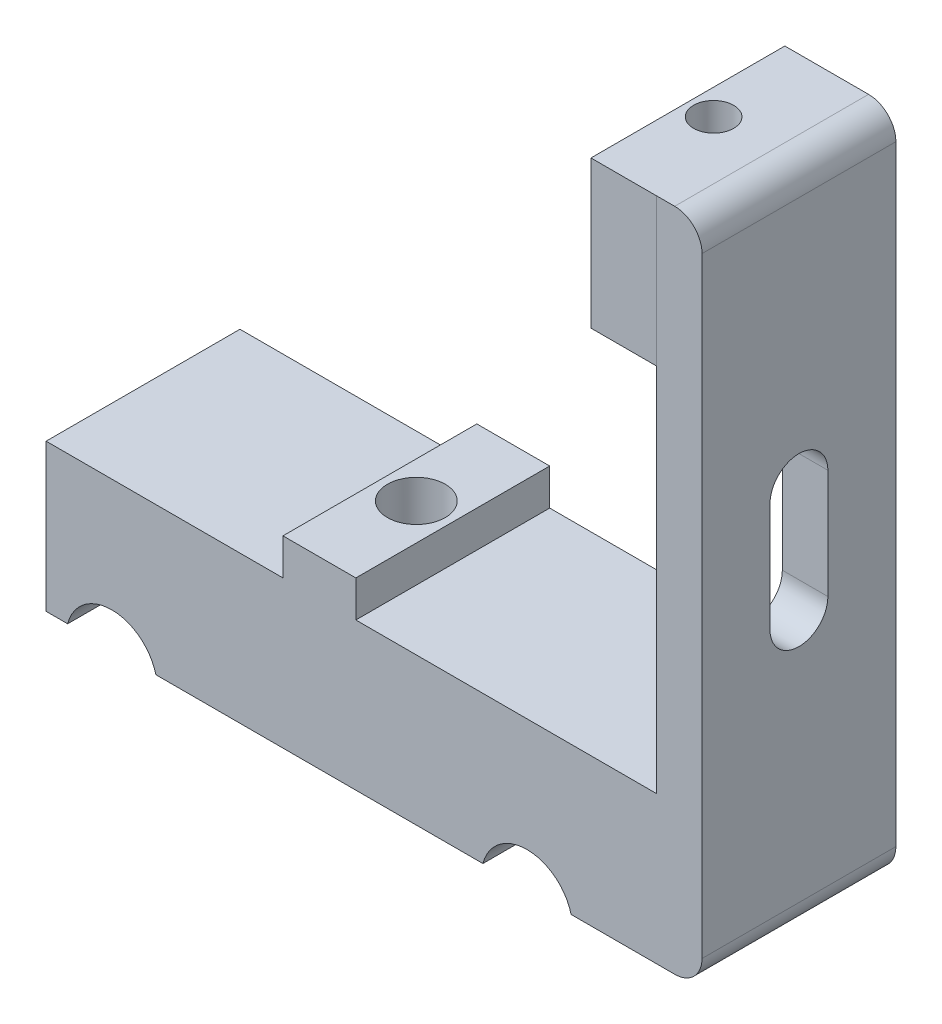
ISO-10303-21;
HEADER;
FILE_DESCRIPTION(('STEP AP214'),'2;1');
FILE_NAME('part.step','',(''),(''),'','','');
FILE_SCHEMA(('AUTOMOTIVE_DESIGN { 1 0 10303 214 1 1 1 1 }'));
ENDSEC;
DATA;
#1=APPLICATION_CONTEXT('core data for automotive mechanical design processes');
#2=APPLICATION_PROTOCOL_DEFINITION('international standard','automotive_design',2000,#1);
#3=PRODUCT_CONTEXT('',#1,'mechanical');
#4=PRODUCT('Part','Part','',(#3));
#5=PRODUCT_RELATED_PRODUCT_CATEGORY('part','',(#4));
#6=PRODUCT_DEFINITION_FORMATION('','',#4);
#7=PRODUCT_DEFINITION_CONTEXT('part definition',#1,'design');
#8=PRODUCT_DEFINITION('design','',#6,#7);
#9=PRODUCT_DEFINITION_SHAPE('','',#8);
#10=(LENGTH_UNIT() NAMED_UNIT(*) SI_UNIT(.MILLI.,.METRE.));
#11=(NAMED_UNIT(*) PLANE_ANGLE_UNIT() SI_UNIT($,.RADIAN.));
#12=(NAMED_UNIT(*) SI_UNIT($,.STERADIAN.) SOLID_ANGLE_UNIT());
#13=UNCERTAINTY_MEASURE_WITH_UNIT(LENGTH_MEASURE(1.E-05),#10,'distance_accuracy_value','');
#14=(GEOMETRIC_REPRESENTATION_CONTEXT(3) GLOBAL_UNCERTAINTY_ASSIGNED_CONTEXT((#13)) GLOBAL_UNIT_ASSIGNED_CONTEXT((#10,
#11,#12)) REPRESENTATION_CONTEXT('',''));
#15=CARTESIAN_POINT('',(0.,0.,0.));
#16=DIRECTION('',(0.,0.,1.));
#17=DIRECTION('',(1.,0.,0.));
#18=AXIS2_PLACEMENT_3D('',#15,#16,#17);
#19=CARTESIAN_POINT('',(37.,52.03,-10.6413287433298));
#20=DIRECTION('',(1.,0.,0.));
#21=DIRECTION('',(0.,1.,0.));
#22=AXIS2_PLACEMENT_3D('',#19,#20,#21);
#23=PLANE('',#22);
#24=DIRECTION('',(0.,1.,0.));
#25=VECTOR('',#24,1.);
#26=CARTESIAN_POINT('',(37.,52.03,-3.175));
#27=LINE('',#26,#25);
#28=CARTESIAN_POINT('',(37.,9.525,-3.175));
#29=VERTEX_POINT('',#28);
#30=CARTESIAN_POINT('',(37.,21.525,-3.175));
#31=VERTEX_POINT('',#30);
#32=EDGE_CURVE('E260',#29,#31,#27,.T.);
#33=ORIENTED_EDGE('',*,*,#32,.T.);
#34=CARTESIAN_POINT('',(37.,21.525,0.));
#35=DIRECTION('',(1.,0.,0.));
#36=DIRECTION('',(0.,1.,0.));
#37=AXIS2_PLACEMENT_3D('',#34,#35,#36);
#38=CIRCLE('',#37,3.175);
#39=CARTESIAN_POINT('',(37.,21.525,3.175));
#40=VERTEX_POINT('',#39);
#41=EDGE_CURVE('E264',#31,#40,#38,.T.);
#42=ORIENTED_EDGE('',*,*,#41,.T.);
#43=DIRECTION('',(0.,-1.,0.));
#44=VECTOR('',#43,1.);
#45=CARTESIAN_POINT('',(37.,52.03,3.175));
#46=LINE('',#45,#44);
#47=CARTESIAN_POINT('',(37.,9.525,3.175));
#48=VERTEX_POINT('',#47);
#49=EDGE_CURVE('E251',#40,#48,#46,.T.);
#50=ORIENTED_EDGE('',*,*,#49,.T.);
#51=CARTESIAN_POINT('',(37.,9.525,0.));
#52=DIRECTION('',(1.,0.,0.));
#53=DIRECTION('',(0.,1.,0.));
#54=AXIS2_PLACEMENT_3D('',#51,#52,#53);
#55=CIRCLE('',#54,3.175);
#56=EDGE_CURVE('E226',#48,#29,#55,.T.);
#57=ORIENTED_EDGE('',*,*,#56,.T.);
#58=EDGE_LOOP('',(#33,#42,#50,#57));
#59=FACE_BOUND('',#58,.T.);
#60=DIRECTION('',(0.,0.,1.));
#61=VECTOR('',#60,1.);
#62=CARTESIAN_POINT('',(37.,35.85,10.6430024789024));
#63=LINE('',#62,#61);
#64=CARTESIAN_POINT('',(37.,35.85,-10.6413287433298));
#65=VERTEX_POINT('',#64);
#66=CARTESIAN_POINT('',(37.,35.85,10.64));
#67=VERTEX_POINT('',#66);
#68=EDGE_CURVE('E305',#65,#67,#63,.T.);
#69=ORIENTED_EDGE('',*,*,#68,.F.);
#70=DIRECTION('',(0.,-1.,0.));
#71=VECTOR('',#70,1.);
#72=CARTESIAN_POINT('',(37.,52.03,-10.6413287433298));
#73=LINE('',#72,#71);
#74=CARTESIAN_POINT('',(37.,-4.8,-10.6413287433298));
#75=VERTEX_POINT('',#74);
#76=EDGE_CURVE('E361',#65,#75,#73,.T.);
#77=ORIENTED_EDGE('',*,*,#76,.T.);
#78=DIRECTION('',(0.,0.,1.));
#79=VECTOR('',#78,1.);
#80=CARTESIAN_POINT('',(37.,-4.8,-10.6413287433298));
#81=LINE('',#80,#79);
#82=CARTESIAN_POINT('',(37.,-4.8,-10.64));
#83=VERTEX_POINT('',#82);
#84=EDGE_CURVE('E341',#75,#83,#81,.T.);
#85=ORIENTED_EDGE('',*,*,#84,.T.);
#86=CARTESIAN_POINT('',(37.,-4.8,10.64));
#87=VERTEX_POINT('',#86);
#88=EDGE_CURVE('E353',#83,#87,#81,.T.);
#89=ORIENTED_EDGE('',*,*,#88,.T.);
#90=DIRECTION('',(0.,-1.,0.));
#91=VECTOR('',#90,1.);
#92=CARTESIAN_POINT('',(37.,52.03,10.64));
#93=LINE('',#92,#91);
#94=EDGE_CURVE('E345',#67,#87,#93,.T.);
#95=ORIENTED_EDGE('',*,*,#94,.F.);
#96=EDGE_LOOP('',(#69,#77,#85,#89,#95));
#97=FACE_BOUND('',#96,.T.);
#98=ADVANCED_FACE('F51',(#59,#97),#23,.F.);
#99=CARTESIAN_POINT('',(0.,-4.8,10.64));
#100=DIRECTION('',(0.,1.,0.));
#101=DIRECTION('',(-1.,0.,0.));
#102=AXIS2_PLACEMENT_3D('',#99,#100,#101);
#103=PLANE('',#102);
#104=CARTESIAN_POINT('',(32.6328780779036,-4.79999999999999,0.));
#105=DIRECTION('',(0.,1.,0.));
#106=DIRECTION('',(-1.,0.,0.));
#107=AXIS2_PLACEMENT_3D('',#104,#105,#106);
#108=CIRCLE('',#107,2.2);
#109=CARTESIAN_POINT('',(30.4328780779036,-4.79999999999999,0.));
#110=VERTEX_POINT('',#109);
#111=EDGE_CURVE('E295',#110,#110,#108,.T.);
#112=ORIENTED_EDGE('',*,*,#111,.F.);
#113=EDGE_LOOP('',(#112));
#114=FACE_BOUND('',#113,.T.);
#115=DIRECTION('',(1.,0.,0.));
#116=VECTOR('',#115,1.);
#117=CARTESIAN_POINT('',(0.,-4.8,10.64));
#118=LINE('',#117,#116);
#119=CARTESIAN_POINT('',(4.00000000000001,-4.8,10.64));
#120=VERTEX_POINT('',#119);
#121=EDGE_CURVE('E417',#120,#87,#118,.T.);
#122=ORIENTED_EDGE('',*,*,#121,.T.);
#123=ORIENTED_EDGE('',*,*,#88,.F.);
#124=DIRECTION('',(1.,0.,0.));
#125=VECTOR('',#124,1.);
#126=CARTESIAN_POINT('',(0.,-4.8,-10.64));
#127=LINE('',#126,#125);
#128=CARTESIAN_POINT('',(4.00000000000001,-4.8,-10.64));
#129=VERTEX_POINT('',#128);
#130=EDGE_CURVE('E440',#129,#83,#127,.T.);
#131=ORIENTED_EDGE('',*,*,#130,.F.);
#132=DIRECTION('',(0.,0.,-1.));
#133=VECTOR('',#132,1.);
#134=CARTESIAN_POINT('',(4.00000000000001,-4.8,10.64));
#135=LINE('',#134,#133);
#136=EDGE_CURVE('E460',#120,#129,#135,.T.);
#137=ORIENTED_EDGE('',*,*,#136,.F.);
#138=EDGE_LOOP('',(#122,#123,#131,#137));
#139=FACE_BOUND('',#138,.T.);
#140=ADVANCED_FACE('F514',(#114,#139),#103,.T.);
#141=CARTESIAN_POINT('',(0.,-20.98,10.64));
#142=DIRECTION('',(0.,1.,0.));
#143=DIRECTION('',(-1.,0.,0.));
#144=AXIS2_PLACEMENT_3D('',#141,#142,#143);
#145=PLANE('',#144);
#146=CARTESIAN_POINT('',(0.000925950515747243,-20.98,0.));
#147=DIRECTION('',(0.,-1.,0.));
#148=DIRECTION('',(1.,0.,0.));
#149=AXIS2_PLACEMENT_3D('',#146,#147,#148);
#150=CIRCLE('',#149,3.175);
#151=CARTESIAN_POINT('',(3.17592595051575,-20.98,0.));
#152=VERTEX_POINT('',#151);
#153=EDGE_CURVE('E282',#152,#152,#150,.T.);
#154=ORIENTED_EDGE('',*,*,#153,.F.);
#155=EDGE_LOOP('',(#154));
#156=FACE_BOUND('',#155,.T.);
#157=DIRECTION('',(0.,0.,-1.));
#158=VECTOR('',#157,1.);
#159=CARTESIAN_POINT('',(-17.9490740494843,-20.98,10.8));
#160=LINE('',#159,#158);
#161=CARTESIAN_POINT('',(-17.9490740494843,-20.98,-10.64));
#162=VERTEX_POINT('',#161);
#163=CARTESIAN_POINT('',(-17.9490740494843,-20.98,10.64));
#164=VERTEX_POINT('',#163);
#165=EDGE_CURVE('E403',#162,#164,#160,.F.);
#166=ORIENTED_EDGE('',*,*,#165,.F.);
#167=DIRECTION('',(1.,0.,0.));
#168=VECTOR('',#167,1.);
#169=CARTESIAN_POINT('',(0.,-20.98,-10.64));
#170=LINE('',#169,#168);
#171=CARTESIAN_POINT('',(17.9490740494842,-20.98,-10.64));
#172=VERTEX_POINT('',#171);
#173=EDGE_CURVE('E441',#162,#172,#170,.T.);
#174=ORIENTED_EDGE('',*,*,#173,.T.);
#175=DIRECTION('',(0.,0.,-1.));
#176=VECTOR('',#175,1.);
#177=CARTESIAN_POINT('',(17.9490740494843,-20.98,10.8));
#178=LINE('',#177,#176);
#179=CARTESIAN_POINT('',(17.9490740494842,-20.98,10.64));
#180=VERTEX_POINT('',#179);
#181=EDGE_CURVE('E390',#180,#172,#178,.T.);
#182=ORIENTED_EDGE('',*,*,#181,.F.);
#183=DIRECTION('',(1.,0.,0.));
#184=VECTOR('',#183,1.);
#185=CARTESIAN_POINT('',(0.,-20.98,10.64));
#186=LINE('',#185,#184);
#187=EDGE_CURVE('E418',#164,#180,#186,.T.);
#188=ORIENTED_EDGE('',*,*,#187,.F.);
#189=EDGE_LOOP('',(#166,#174,#182,#188));
#190=FACE_BOUND('',#189,.T.);
#191=ADVANCED_FACE('F522',(#156,#190),#145,.F.);
#192=DIRECTION('',(0.,0.,-1.));
#193=VECTOR('',#192,1.);
#194=CARTESIAN_POINT('',(-27.6328780779036,-20.98,10.8));
#195=LINE('',#194,#193);
#196=CARTESIAN_POINT('',(-27.6328780779036,-20.98,10.64));
#197=VERTEX_POINT('',#196);
#198=CARTESIAN_POINT('',(-27.6328780779036,-20.98,-10.64));
#199=VERTEX_POINT('',#198);
#200=EDGE_CURVE('E400',#197,#199,#195,.T.);
#201=ORIENTED_EDGE('',*,*,#200,.F.);
#202=CARTESIAN_POINT('',(-30.,-20.98,10.64));
#203=VERTEX_POINT('',#202);
#204=EDGE_CURVE('E413',#203,#197,#186,.T.);
#205=ORIENTED_EDGE('',*,*,#204,.F.);
#206=DIRECTION('',(0.,0.,-1.));
#207=VECTOR('',#206,1.);
#208=CARTESIAN_POINT('',(-30.,-20.98,10.64));
#209=LINE('',#208,#207);
#210=CARTESIAN_POINT('',(-30.,-20.98,-10.64));
#211=VERTEX_POINT('',#210);
#212=EDGE_CURVE('E464',#203,#211,#209,.T.);
#213=ORIENTED_EDGE('',*,*,#212,.T.);
#214=EDGE_CURVE('E436',#211,#199,#170,.T.);
#215=ORIENTED_EDGE('',*,*,#214,.T.);
#216=EDGE_LOOP('',(#201,#205,#213,#215));
#217=FACE_BOUND('',#216,.T.);
#218=ADVANCED_FACE('F567',(#217),#145,.F.);
#219=CARTESIAN_POINT('',(32.6328780779036,-20.98,0.));
#220=DIRECTION('',(0.,-1.,0.));
#221=DIRECTION('',(1.,0.,0.));
#222=AXIS2_PLACEMENT_3D('',#219,#220,#221);
#223=CIRCLE('',#222,2.2);
#224=CARTESIAN_POINT('',(34.8328780779036,-20.98,0.));
#225=VERTEX_POINT('',#224);
#226=EDGE_CURVE('E286',#225,#225,#223,.T.);
#227=ORIENTED_EDGE('',*,*,#226,.F.);
#228=EDGE_LOOP('',(#227));
#229=FACE_BOUND('',#228,.T.);
#230=CARTESIAN_POINT('',(27.6328780779036,-20.98,-10.64));
#231=VERTEX_POINT('',#230);
#232=CARTESIAN_POINT('',(39.,-20.98,-10.64));
#233=VERTEX_POINT('',#232);
#234=EDGE_CURVE('E435',#231,#233,#170,.T.);
#235=ORIENTED_EDGE('',*,*,#234,.T.);
#236=DIRECTION('',(0.,0.,-1.));
#237=VECTOR('',#236,1.);
#238=CARTESIAN_POINT('',(39.,-20.98,10.64));
#239=LINE('',#238,#237);
#240=CARTESIAN_POINT('',(39.,-20.98,10.64));
#241=VERTEX_POINT('',#240);
#242=EDGE_CURVE('E12',#233,#241,#239,.F.);
#243=ORIENTED_EDGE('',*,*,#242,.T.);
#244=CARTESIAN_POINT('',(27.6328780779036,-20.98,10.64));
#245=VERTEX_POINT('',#244);
#246=EDGE_CURVE('E411',#245,#241,#186,.T.);
#247=ORIENTED_EDGE('',*,*,#246,.F.);
#248=DIRECTION('',(0.,0.,-1.));
#249=VECTOR('',#248,1.);
#250=CARTESIAN_POINT('',(27.6328780779036,-20.98,10.8));
#251=LINE('',#250,#249);
#252=EDGE_CURVE('E393',#231,#245,#251,.F.);
#253=ORIENTED_EDGE('',*,*,#252,.F.);
#254=EDGE_LOOP('',(#235,#243,#247,#253));
#255=FACE_BOUND('',#254,.T.);
#256=ADVANCED_FACE('F569',(#229,#255),#145,.F.);
#257=CARTESIAN_POINT('',(-30.,0.,10.64));
#258=DIRECTION('',(1.,0.,0.));
#259=DIRECTION('',(0.,0.,-1.));
#260=AXIS2_PLACEMENT_3D('',#257,#258,#259);
#261=PLANE('',#260);
#262=DIRECTION('',(0.,-1.,0.));
#263=VECTOR('',#262,1.);
#264=CARTESIAN_POINT('',(-30.,0.,-10.64));
#265=LINE('',#264,#263);
#266=CARTESIAN_POINT('',(-30.,-4.8,-10.64));
#267=VERTEX_POINT('',#266);
#268=EDGE_CURVE('E406',#267,#211,#265,.T.);
#269=ORIENTED_EDGE('',*,*,#268,.T.);
#270=ORIENTED_EDGE('',*,*,#212,.F.);
#271=DIRECTION('',(0.,-1.,0.));
#272=VECTOR('',#271,1.);
#273=CARTESIAN_POINT('',(-30.,0.,10.64));
#274=LINE('',#273,#272);
#275=CARTESIAN_POINT('',(-30.,-4.8,10.64));
#276=VERTEX_POINT('',#275);
#277=EDGE_CURVE('E407',#276,#203,#274,.T.);
#278=ORIENTED_EDGE('',*,*,#277,.F.);
#279=DIRECTION('',(0.,0.,-1.));
#280=VECTOR('',#279,1.);
#281=CARTESIAN_POINT('',(-30.,-4.8,10.64));
#282=LINE('',#281,#280);
#283=EDGE_CURVE('E431',#276,#267,#282,.T.);
#284=ORIENTED_EDGE('',*,*,#283,.T.);
#285=EDGE_LOOP('',(#269,#270,#278,#284));
#286=FACE_BOUND('',#285,.T.);
#287=ADVANCED_FACE('F562',(#286),#261,.F.);
#288=CARTESIAN_POINT('',(4.,0.,10.64));
#289=DIRECTION('',(1.,0.,0.));
#290=DIRECTION('',(0.,1.,0.));
#291=AXIS2_PLACEMENT_3D('',#288,#289,#290);
#292=PLANE('',#291);
#293=DIRECTION('',(0.,0.,-1.));
#294=VECTOR('',#293,1.);
#295=CARTESIAN_POINT('',(4.,-0.8,10.64));
#296=LINE('',#295,#294);
#297=CARTESIAN_POINT('',(4.,-0.8,10.64));
#298=VERTEX_POINT('',#297);
#299=CARTESIAN_POINT('',(4.,-0.8,-10.64));
#300=VERTEX_POINT('',#299);
#301=EDGE_CURVE('E276',#298,#300,#296,.T.);
#302=ORIENTED_EDGE('',*,*,#301,.F.);
#303=DIRECTION('',(0.,-1.,0.));
#304=VECTOR('',#303,1.);
#305=CARTESIAN_POINT('',(4.,0.,10.64));
#306=LINE('',#305,#304);
#307=EDGE_CURVE('E422',#298,#120,#306,.T.);
#308=ORIENTED_EDGE('',*,*,#307,.T.);
#309=ORIENTED_EDGE('',*,*,#136,.T.);
#310=DIRECTION('',(0.,-1.,0.));
#311=VECTOR('',#310,1.);
#312=CARTESIAN_POINT('',(4.,0.,-10.64));
#313=LINE('',#312,#311);
#314=EDGE_CURVE('E445',#300,#129,#313,.T.);
#315=ORIENTED_EDGE('',*,*,#314,.F.);
#316=EDGE_LOOP('',(#302,#308,#309,#315));
#317=FACE_BOUND('',#316,.T.);
#318=ADVANCED_FACE('F559',(#317),#292,.T.);
#319=CARTESIAN_POINT('',(-4.,0.,10.64));
#320=DIRECTION('',(1.,0.,0.));
#321=DIRECTION('',(0.,0.,-1.));
#322=AXIS2_PLACEMENT_3D('',#319,#320,#321);
#323=PLANE('',#322);
#324=DIRECTION('',(0.,-1.,0.));
#325=VECTOR('',#324,1.);
#326=CARTESIAN_POINT('',(-4.,0.,10.64));
#327=LINE('',#326,#325);
#328=CARTESIAN_POINT('',(-4.,-0.8,10.64));
#329=VERTEX_POINT('',#328);
#330=CARTESIAN_POINT('',(-4.,-4.8,10.64));
#331=VERTEX_POINT('',#330);
#332=EDGE_CURVE('E425',#329,#331,#327,.T.);
#333=ORIENTED_EDGE('',*,*,#332,.F.);
#334=DIRECTION('',(0.,0.,-1.));
#335=VECTOR('',#334,1.);
#336=CARTESIAN_POINT('',(-4.,-0.8,10.64));
#337=LINE('',#336,#335);
#338=CARTESIAN_POINT('',(-4.,-0.8,-10.64));
#339=VERTEX_POINT('',#338);
#340=EDGE_CURVE('E272',#329,#339,#337,.T.);
#341=ORIENTED_EDGE('',*,*,#340,.T.);
#342=DIRECTION('',(0.,-1.,0.));
#343=VECTOR('',#342,1.);
#344=CARTESIAN_POINT('',(-4.,0.,-10.64));
#345=LINE('',#344,#343);
#346=CARTESIAN_POINT('',(-4.,-4.8,-10.64));
#347=VERTEX_POINT('',#346);
#348=EDGE_CURVE('E448',#339,#347,#345,.T.);
#349=ORIENTED_EDGE('',*,*,#348,.T.);
#350=DIRECTION('',(0.,0.,-1.));
#351=VECTOR('',#350,1.);
#352=CARTESIAN_POINT('',(-4.,-4.8,10.64));
#353=LINE('',#352,#351);
#354=EDGE_CURVE('E456',#331,#347,#353,.T.);
#355=ORIENTED_EDGE('',*,*,#354,.F.);
#356=EDGE_LOOP('',(#333,#341,#349,#355));
#357=FACE_BOUND('',#356,.T.);
#358=ADVANCED_FACE('F555',(#357),#323,.F.);
#359=CARTESIAN_POINT('',(0.,-4.8,10.64));
#360=DIRECTION('',(0.,-1.,0.));
#361=DIRECTION('',(1.,0.,0.));
#362=AXIS2_PLACEMENT_3D('',#359,#360,#361);
#363=PLANE('',#362);
#364=DIRECTION('',(-1.,0.,0.));
#365=VECTOR('',#364,1.);
#366=CARTESIAN_POINT('',(0.,-4.8,-10.64));
#367=LINE('',#366,#365);
#368=EDGE_CURVE('E412',#347,#267,#367,.T.);
#369=ORIENTED_EDGE('',*,*,#368,.T.);
#370=ORIENTED_EDGE('',*,*,#283,.F.);
#371=DIRECTION('',(-1.,0.,0.));
#372=VECTOR('',#371,1.);
#373=CARTESIAN_POINT('',(0.,-4.8,10.64));
#374=LINE('',#373,#372);
#375=EDGE_CURVE('E428',#331,#276,#374,.T.);
#376=ORIENTED_EDGE('',*,*,#375,.F.);
#377=ORIENTED_EDGE('',*,*,#354,.T.);
#378=EDGE_LOOP('',(#369,#370,#376,#377));
#379=FACE_BOUND('',#378,.T.);
#380=ADVANCED_FACE('F548',(#379),#363,.F.);
#381=CARTESIAN_POINT('',(0.,0.,10.64));
#382=DIRECTION('',(0.,0.,1.));
#383=DIRECTION('',(1.,0.,0.));
#384=AXIS2_PLACEMENT_3D('',#381,#382,#383);
#385=PLANE('',#384);
#386=DIRECTION('',(1.,0.,0.));
#387=VECTOR('',#386,1.);
#388=CARTESIAN_POINT('',(0.,-0.8,10.64));
#389=LINE('',#388,#387);
#390=EDGE_CURVE('E279',#329,#298,#389,.T.);
#391=ORIENTED_EDGE('',*,*,#390,.F.);
#392=ORIENTED_EDGE('',*,*,#332,.T.);
#393=ORIENTED_EDGE('',*,*,#375,.T.);
#394=ORIENTED_EDGE('',*,*,#277,.T.);
#395=ORIENTED_EDGE('',*,*,#204,.T.);
#396=CARTESIAN_POINT('',(-22.7909760636939,-22.227391231648,10.64));
#397=DIRECTION('',(0.,0.,1.));
#398=DIRECTION('',(1.,0.,0.));
#399=AXIS2_PLACEMENT_3D('',#396,#397,#398);
#400=CIRCLE('',#399,5.);
#401=EDGE_CURVE('E396',#197,#164,#400,.F.);
#402=ORIENTED_EDGE('',*,*,#401,.T.);
#403=ORIENTED_EDGE('',*,*,#187,.T.);
#404=CARTESIAN_POINT('',(22.7909760636939,-22.227391231648,10.64));
#405=DIRECTION('',(0.,0.,1.));
#406=DIRECTION('',(1.,0.,0.));
#407=AXIS2_PLACEMENT_3D('',#404,#405,#406);
#408=CIRCLE('',#407,5.);
#409=EDGE_CURVE('E383',#180,#245,#408,.F.);
#410=ORIENTED_EDGE('',*,*,#409,.T.);
#411=ORIENTED_EDGE('',*,*,#246,.T.);
#412=CARTESIAN_POINT('',(39.,-17.98,10.64));
#413=DIRECTION('',(0.,0.,1.));
#414=DIRECTION('',(1.,0.,0.));
#415=AXIS2_PLACEMENT_3D('',#412,#413,#414);
#416=CIRCLE('',#415,3.);
#417=CARTESIAN_POINT('',(42.,-17.98,10.64));
#418=VERTEX_POINT('',#417);
#419=EDGE_CURVE('E482',#241,#418,#416,.T.);
#420=ORIENTED_EDGE('',*,*,#419,.T.);
#421=DIRECTION('',(0.,-1.,0.));
#422=VECTOR('',#421,1.);
#423=CARTESIAN_POINT('',(42.,-4.8,10.64));
#424=LINE('',#423,#422);
#425=CARTESIAN_POINT('',(42.,49.03,10.64));
#426=VERTEX_POINT('',#425);
#427=EDGE_CURVE('E371',#426,#418,#424,.T.);
#428=ORIENTED_EDGE('',*,*,#427,.F.);
#429=CARTESIAN_POINT('',(39.,49.03,10.64));
#430=DIRECTION('',(0.,0.,1.));
#431=DIRECTION('',(1.,0.,0.));
#432=AXIS2_PLACEMENT_3D('',#429,#430,#431);
#433=CIRCLE('',#432,3.);
#434=CARTESIAN_POINT('',(39.,52.03,10.64));
#435=VERTEX_POINT('',#434);
#436=EDGE_CURVE('E485',#426,#435,#433,.T.);
#437=ORIENTED_EDGE('',*,*,#436,.T.);
#438=DIRECTION('',(1.,0.,0.));
#439=VECTOR('',#438,1.);
#440=CARTESIAN_POINT('',(42.,52.03,10.64));
#441=LINE('',#440,#439);
#442=CARTESIAN_POINT('',(37.,52.03,10.64));
#443=VERTEX_POINT('',#442);
#444=EDGE_CURVE('E340',#443,#435,#441,.T.);
#445=ORIENTED_EDGE('',*,*,#444,.F.);
#446=EDGE_CURVE('E357',#443,#67,#93,.T.);
#447=ORIENTED_EDGE('',*,*,#446,.T.);
#448=ORIENTED_EDGE('',*,*,#94,.T.);
#449=ORIENTED_EDGE('',*,*,#121,.F.);
#450=ORIENTED_EDGE('',*,*,#307,.F.);
#451=EDGE_LOOP('',(#391,#392,#393,#394,#395,#402,#403,#410,#411,#420,#428,#437,#445,#447,#448,
#449,#450));
#452=FACE_BOUND('',#451,.T.);
#453=ADVANCED_FACE('F545',(#452),#385,.T.);
#454=CARTESIAN_POINT('',(0.,0.,-10.64));
#455=DIRECTION('',(0.,0.,1.));
#456=DIRECTION('',(1.,0.,0.));
#457=AXIS2_PLACEMENT_3D('',#454,#455,#456);
#458=PLANE('',#457);
#459=ORIENTED_EDGE('',*,*,#348,.F.);
#460=DIRECTION('',(1.,0.,0.));
#461=VECTOR('',#460,1.);
#462=CARTESIAN_POINT('',(0.,-0.8,-10.64));
#463=LINE('',#462,#461);
#464=EDGE_CURVE('E268',#339,#300,#463,.T.);
#465=ORIENTED_EDGE('',*,*,#464,.T.);
#466=ORIENTED_EDGE('',*,*,#314,.T.);
#467=ORIENTED_EDGE('',*,*,#130,.T.);
#468=DIRECTION('',(1.,0.,0.));
#469=VECTOR('',#468,1.);
#470=CARTESIAN_POINT('',(0.,-4.8,-10.64));
#471=LINE('',#470,#469);
#472=CARTESIAN_POINT('',(42.,-4.8,-10.64));
#473=VERTEX_POINT('',#472);
#474=EDGE_CURVE('E367',#83,#473,#471,.T.);
#475=ORIENTED_EDGE('',*,*,#474,.T.);
#476=DIRECTION('',(0.,1.,0.));
#477=VECTOR('',#476,1.);
#478=CARTESIAN_POINT('',(42.,-4.8,-10.64));
#479=LINE('',#478,#477);
#480=CARTESIAN_POINT('',(42.,-17.98,-10.64));
#481=VERTEX_POINT('',#480);
#482=EDGE_CURVE('E375',#481,#473,#479,.T.);
#483=ORIENTED_EDGE('',*,*,#482,.F.);
#484=CARTESIAN_POINT('',(39.,-17.98,-10.64));
#485=DIRECTION('',(0.,0.,1.));
#486=DIRECTION('',(1.,0.,0.));
#487=AXIS2_PLACEMENT_3D('',#484,#485,#486);
#488=CIRCLE('',#487,3.);
#489=EDGE_CURVE('E61',#481,#233,#488,.F.);
#490=ORIENTED_EDGE('',*,*,#489,.T.);
#491=ORIENTED_EDGE('',*,*,#234,.F.);
#492=CARTESIAN_POINT('',(22.7909760636939,-22.227391231648,-10.64));
#493=DIRECTION('',(0.,0.,1.));
#494=DIRECTION('',(-1.,0.,0.));
#495=AXIS2_PLACEMENT_3D('',#492,#493,#494);
#496=CIRCLE('',#495,5.);
#497=EDGE_CURVE('E378',#231,#172,#496,.T.);
#498=ORIENTED_EDGE('',*,*,#497,.T.);
#499=ORIENTED_EDGE('',*,*,#173,.F.);
#500=CARTESIAN_POINT('',(-22.7909760636939,-22.227391231648,-10.64));
#501=DIRECTION('',(0.,0.,1.));
#502=DIRECTION('',(1.,0.,0.));
#503=AXIS2_PLACEMENT_3D('',#500,#501,#502);
#504=CIRCLE('',#503,5.);
#505=EDGE_CURVE('E379',#162,#199,#504,.T.);
#506=ORIENTED_EDGE('',*,*,#505,.T.);
#507=ORIENTED_EDGE('',*,*,#214,.F.);
#508=ORIENTED_EDGE('',*,*,#268,.F.);
#509=ORIENTED_EDGE('',*,*,#368,.F.);
#510=EDGE_LOOP('',(#459,#465,#466,#467,#475,#483,#490,#491,#498,#499,#506,#507,#508,#509));
#511=FACE_BOUND('',#510,.T.);
#512=ADVANCED_FACE('F543',(#511),#458,.F.);
#513=CARTESIAN_POINT('',(22.7909760636939,-22.227391231648,10.8));
#514=DIRECTION('',(0.,0.,-1.));
#515=DIRECTION('',(-1.,0.,0.));
#516=AXIS2_PLACEMENT_3D('',#513,#514,#515);
#517=CYLINDRICAL_SURFACE('',#516,5.);
#518=ORIENTED_EDGE('',*,*,#252,.T.);
#519=ORIENTED_EDGE('',*,*,#409,.F.);
#520=ORIENTED_EDGE('',*,*,#181,.T.);
#521=ORIENTED_EDGE('',*,*,#497,.F.);
#522=EDGE_LOOP('',(#518,#519,#520,#521));
#523=FACE_BOUND('',#522,.T.);
#524=ADVANCED_FACE('F539',(#523),#517,.F.);
#525=CARTESIAN_POINT('',(-22.7909760636939,-22.227391231648,10.8));
#526=DIRECTION('',(0.,0.,-1.));
#527=DIRECTION('',(-1.,0.,0.));
#528=AXIS2_PLACEMENT_3D('',#525,#526,#527);
#529=CYLINDRICAL_SURFACE('',#528,5.);
#530=ORIENTED_EDGE('',*,*,#165,.T.);
#531=ORIENTED_EDGE('',*,*,#401,.F.);
#532=ORIENTED_EDGE('',*,*,#200,.T.);
#533=ORIENTED_EDGE('',*,*,#505,.F.);
#534=EDGE_LOOP('',(#530,#531,#532,#533));
#535=FACE_BOUND('',#534,.T.);
#536=ADVANCED_FACE('F536',(#535),#529,.F.);
#537=CARTESIAN_POINT('',(42.,0.,0.));
#538=DIRECTION('',(1.,0.,0.));
#539=DIRECTION('',(0.,0.,-1.));
#540=AXIS2_PLACEMENT_3D('',#537,#538,#539);
#541=PLANE('',#540);
#542=CARTESIAN_POINT('',(42.,21.525,0.));
#543=DIRECTION('',(1.,0.,0.));
#544=DIRECTION('',(0.,0.,-1.));
#545=AXIS2_PLACEMENT_3D('',#542,#543,#544);
#546=CIRCLE('',#545,3.175);
#547=CARTESIAN_POINT('',(42.,21.525,-3.175));
#548=VERTEX_POINT('',#547);
#549=CARTESIAN_POINT('',(42.,21.525,3.175));
#550=VERTEX_POINT('',#549);
#551=EDGE_CURVE('E77',#548,#550,#546,.T.);
#552=ORIENTED_EDGE('',*,*,#551,.F.);
#553=DIRECTION('',(0.,1.,0.));
#554=VECTOR('',#553,1.);
#555=CARTESIAN_POINT('',(42.,21.525,-3.175));
#556=LINE('',#555,#554);
#557=CARTESIAN_POINT('',(42.,9.525,-3.175));
#558=VERTEX_POINT('',#557);
#559=EDGE_CURVE('E241',#558,#548,#556,.T.);
#560=ORIENTED_EDGE('',*,*,#559,.F.);
#561=CARTESIAN_POINT('',(42.,9.525,0.));
#562=DIRECTION('',(1.,0.,0.));
#563=DIRECTION('',(0.,0.,-1.));
#564=AXIS2_PLACEMENT_3D('',#561,#562,#563);
#565=CIRCLE('',#564,3.175);
#566=CARTESIAN_POINT('',(42.,9.525,3.175));
#567=VERTEX_POINT('',#566);
#568=EDGE_CURVE('E223',#567,#558,#565,.T.);
#569=ORIENTED_EDGE('',*,*,#568,.F.);
#570=DIRECTION('',(0.,-1.,0.));
#571=VECTOR('',#570,1.);
#572=CARTESIAN_POINT('',(42.,21.525,3.175));
#573=LINE('',#572,#571);
#574=EDGE_CURVE('E233',#550,#567,#573,.T.);
#575=ORIENTED_EDGE('',*,*,#574,.F.);
#576=EDGE_LOOP('',(#552,#560,#569,#575));
#577=FACE_BOUND('',#576,.T.);
#578=DIRECTION('',(0.,-1.,0.));
#579=VECTOR('',#578,1.);
#580=CARTESIAN_POINT('',(42.,52.03,-10.6413287433298));
#581=LINE('',#580,#579);
#582=CARTESIAN_POINT('',(42.,49.03,-10.6413287433298));
#583=VERTEX_POINT('',#582);
#584=CARTESIAN_POINT('',(42.,-4.8,-10.6413287433298));
#585=VERTEX_POINT('',#584);
#586=EDGE_CURVE('E364',#583,#585,#581,.T.);
#587=ORIENTED_EDGE('',*,*,#586,.F.);
#588=DIRECTION('',(0.,0.,-1.));
#589=VECTOR('',#588,1.);
#590=CARTESIAN_POINT('',(42.,49.03,10.64));
#591=LINE('',#590,#589);
#592=EDGE_CURVE('E479',#583,#426,#591,.F.);
#593=ORIENTED_EDGE('',*,*,#592,.T.);
#594=ORIENTED_EDGE('',*,*,#427,.T.);
#595=DIRECTION('',(0.,0.,-1.));
#596=VECTOR('',#595,1.);
#597=CARTESIAN_POINT('',(42.,-17.98,-10.64));
#598=LINE('',#597,#596);
#599=EDGE_CURVE('E475',#418,#481,#598,.T.);
#600=ORIENTED_EDGE('',*,*,#599,.T.);
#601=ORIENTED_EDGE('',*,*,#482,.T.);
#602=DIRECTION('',(0.,0.,-1.));
#603=VECTOR('',#602,1.);
#604=CARTESIAN_POINT('',(42.,-4.8,-10.6413287433298));
#605=LINE('',#604,#603);
#606=EDGE_CURVE('E336',#473,#585,#605,.T.);
#607=ORIENTED_EDGE('',*,*,#606,.T.);
#608=EDGE_LOOP('',(#587,#593,#594,#600,#601,#607));
#609=FACE_BOUND('',#608,.T.);
#610=ADVANCED_FACE('F238',(#577,#609),#541,.T.);
#611=CARTESIAN_POINT('',(0.,-4.8,0.));
#612=DIRECTION('',(0.,-1.,0.));
#613=DIRECTION('',(1.,0.,0.));
#614=AXIS2_PLACEMENT_3D('',#611,#612,#613);
#615=PLANE('',#614);
#616=ORIENTED_EDGE('',*,*,#474,.F.);
#617=ORIENTED_EDGE('',*,*,#84,.F.);
#618=DIRECTION('',(-1.,0.,0.));
#619=VECTOR('',#618,1.);
#620=CARTESIAN_POINT('',(42.,-4.8,-10.6413287433298));
#621=LINE('',#620,#619);
#622=EDGE_CURVE('E349',#585,#75,#621,.T.);
#623=ORIENTED_EDGE('',*,*,#622,.F.);
#624=ORIENTED_EDGE('',*,*,#606,.F.);
#625=EDGE_LOOP('',(#616,#617,#623,#624));
#626=FACE_BOUND('',#625,.T.);
#627=ADVANCED_FACE('F528',(#626),#615,.T.);
#628=CARTESIAN_POINT('',(42.,52.03,-10.6413287433298));
#629=DIRECTION('',(0.,0.,1.));
#630=DIRECTION('',(1.,0.,0.));
#631=AXIS2_PLACEMENT_3D('',#628,#629,#630);
#632=PLANE('',#631);
#633=DIRECTION('',(-1.,0.,0.));
#634=VECTOR('',#633,1.);
#635=CARTESIAN_POINT('',(42.,52.03,-10.6413287433298));
#636=LINE('',#635,#634);
#637=CARTESIAN_POINT('',(39.,52.03,-10.6413287433298));
#638=VERTEX_POINT('',#637);
#639=CARTESIAN_POINT('',(29.81,52.03,-10.6413287433298));
#640=VERTEX_POINT('',#639);
#641=EDGE_CURVE('E337',#638,#640,#636,.T.);
#642=ORIENTED_EDGE('',*,*,#641,.F.);
#643=CARTESIAN_POINT('',(39.,49.03,-10.6413287433298));
#644=DIRECTION('',(0.,0.,1.));
#645=DIRECTION('',(1.,0.,0.));
#646=AXIS2_PLACEMENT_3D('',#643,#644,#645);
#647=CIRCLE('',#646,3.);
#648=EDGE_CURVE('E472',#638,#583,#647,.F.);
#649=ORIENTED_EDGE('',*,*,#648,.T.);
#650=ORIENTED_EDGE('',*,*,#586,.T.);
#651=ORIENTED_EDGE('',*,*,#622,.T.);
#652=ORIENTED_EDGE('',*,*,#76,.F.);
#653=DIRECTION('',(1.,0.,0.));
#654=VECTOR('',#653,1.);
#655=CARTESIAN_POINT('',(29.81,35.85,-10.6413287433298));
#656=LINE('',#655,#654);
#657=CARTESIAN_POINT('',(29.81,35.85,-10.6413287433298));
#658=VERTEX_POINT('',#657);
#659=EDGE_CURVE('E329',#658,#65,#656,.T.);
#660=ORIENTED_EDGE('',*,*,#659,.F.);
#661=DIRECTION('',(0.,-1.,0.));
#662=VECTOR('',#661,1.);
#663=CARTESIAN_POINT('',(29.81,52.03,-10.6413287433298));
#664=LINE('',#663,#662);
#665=EDGE_CURVE('E309',#640,#658,#664,.T.);
#666=ORIENTED_EDGE('',*,*,#665,.F.);
#667=EDGE_LOOP('',(#642,#649,#650,#651,#652,#660,#666));
#668=FACE_BOUND('',#667,.T.);
#669=ADVANCED_FACE('F530',(#668),#632,.F.);
#670=CARTESIAN_POINT('',(0.,52.03,0.));
#671=DIRECTION('',(0.,-1.,0.));
#672=DIRECTION('',(1.,0.,0.));
#673=AXIS2_PLACEMENT_3D('',#670,#671,#672);
#674=PLANE('',#673);
#675=CARTESIAN_POINT('',(32.6328780779036,52.03,0.));
#676=DIRECTION('',(0.,-1.,0.));
#677=DIRECTION('',(1.,0.,0.));
#678=AXIS2_PLACEMENT_3D('',#675,#676,#677);
#679=CIRCLE('',#678,2.2);
#680=CARTESIAN_POINT('',(34.8328780779036,52.03,0.));
#681=VERTEX_POINT('',#680);
#682=EDGE_CURVE('E287',#681,#681,#679,.T.);
#683=ORIENTED_EDGE('',*,*,#682,.T.);
#684=EDGE_LOOP('',(#683));
#685=FACE_BOUND('',#684,.T.);
#686=ORIENTED_EDGE('',*,*,#444,.T.);
#687=DIRECTION('',(0.,0.,-1.));
#688=VECTOR('',#687,1.);
#689=CARTESIAN_POINT('',(39.,52.03,-10.6413287433298));
#690=LINE('',#689,#688);
#691=EDGE_CURVE('E468',#435,#638,#690,.T.);
#692=ORIENTED_EDGE('',*,*,#691,.T.);
#693=ORIENTED_EDGE('',*,*,#641,.T.);
#694=DIRECTION('',(0.,0.,-1.));
#695=VECTOR('',#694,1.);
#696=CARTESIAN_POINT('',(29.81,52.03,10.6430024789024));
#697=LINE('',#696,#695);
#698=CARTESIAN_POINT('',(29.81,52.03,10.6430024789024));
#699=VERTEX_POINT('',#698);
#700=EDGE_CURVE('E304',#699,#640,#697,.T.);
#701=ORIENTED_EDGE('',*,*,#700,.F.);
#702=DIRECTION('',(1.,0.,0.));
#703=VECTOR('',#702,1.);
#704=CARTESIAN_POINT('',(29.81,52.03,10.6430024789024));
#705=LINE('',#704,#703);
#706=CARTESIAN_POINT('',(37.,52.03,10.6430024789024));
#707=VERTEX_POINT('',#706);
#708=EDGE_CURVE('E332',#699,#707,#705,.T.);
#709=ORIENTED_EDGE('',*,*,#708,.T.);
#710=DIRECTION('',(0.,0.,-1.));
#711=VECTOR('',#710,1.);
#712=CARTESIAN_POINT('',(37.,52.03,10.6430024789024));
#713=LINE('',#712,#711);
#714=EDGE_CURVE('E319',#707,#443,#713,.T.);
#715=ORIENTED_EDGE('',*,*,#714,.T.);
#716=EDGE_LOOP('',(#686,#692,#693,#701,#709,#715));
#717=FACE_BOUND('',#716,.T.);
#718=ADVANCED_FACE('F533',(#685,#717),#674,.F.);
#719=CARTESIAN_POINT('',(29.81,52.03,10.6430024789024));
#720=DIRECTION('',(0.,0.,-1.));
#721=DIRECTION('',(0.,1.,0.));
#722=AXIS2_PLACEMENT_3D('',#719,#720,#721);
#723=PLANE('',#722);
#724=DIRECTION('',(0.,1.,0.));
#725=VECTOR('',#724,1.);
#726=CARTESIAN_POINT('',(37.,52.03,10.6430024789024));
#727=LINE('',#726,#725);
#728=CARTESIAN_POINT('',(37.,35.85,10.6430024789024));
#729=VERTEX_POINT('',#728);
#730=EDGE_CURVE('E299',#729,#707,#727,.T.);
#731=ORIENTED_EDGE('',*,*,#730,.T.);
#732=ORIENTED_EDGE('',*,*,#708,.F.);
#733=DIRECTION('',(0.,1.,0.));
#734=VECTOR('',#733,1.);
#735=CARTESIAN_POINT('',(29.81,52.03,10.6430024789024));
#736=LINE('',#735,#734);
#737=CARTESIAN_POINT('',(29.81,35.85,10.6430024789024));
#738=VERTEX_POINT('',#737);
#739=EDGE_CURVE('E300',#738,#699,#736,.T.);
#740=ORIENTED_EDGE('',*,*,#739,.F.);
#741=DIRECTION('',(1.,0.,0.));
#742=VECTOR('',#741,1.);
#743=CARTESIAN_POINT('',(29.81,35.85,10.6430024789024));
#744=LINE('',#743,#742);
#745=EDGE_CURVE('E315',#738,#729,#744,.T.);
#746=ORIENTED_EDGE('',*,*,#745,.T.);
#747=EDGE_LOOP('',(#731,#732,#740,#746));
#748=FACE_BOUND('',#747,.T.);
#749=ADVANCED_FACE('F646',(#748),#723,.F.);
#750=CARTESIAN_POINT('',(29.81,35.85,10.6430024789024));
#751=DIRECTION('',(0.,1.,0.));
#752=DIRECTION('',(0.,0.,1.));
#753=AXIS2_PLACEMENT_3D('',#750,#751,#752);
#754=PLANE('',#753);
#755=CARTESIAN_POINT('',(32.6328780779036,35.85,0.));
#756=DIRECTION('',(0.,1.,0.));
#757=DIRECTION('',(0.,0.,1.));
#758=AXIS2_PLACEMENT_3D('',#755,#756,#757);
#759=CIRCLE('',#758,2.2);
#760=CARTESIAN_POINT('',(32.6328780779036,35.85,2.2));
#761=VERTEX_POINT('',#760);
#762=EDGE_CURVE('E291',#761,#761,#759,.T.);
#763=ORIENTED_EDGE('',*,*,#762,.T.);
#764=EDGE_LOOP('',(#763));
#765=FACE_BOUND('',#764,.T.);
#766=ORIENTED_EDGE('',*,*,#68,.T.);
#767=EDGE_CURVE('E322',#67,#729,#63,.T.);
#768=ORIENTED_EDGE('',*,*,#767,.T.);
#769=ORIENTED_EDGE('',*,*,#745,.F.);
#770=DIRECTION('',(0.,0.,1.));
#771=VECTOR('',#770,1.);
#772=CARTESIAN_POINT('',(29.81,35.85,10.6430024789024));
#773=LINE('',#772,#771);
#774=EDGE_CURVE('E312',#658,#738,#773,.T.);
#775=ORIENTED_EDGE('',*,*,#774,.F.);
#776=ORIENTED_EDGE('',*,*,#659,.T.);
#777=EDGE_LOOP('',(#766,#768,#769,#775,#776));
#778=FACE_BOUND('',#777,.T.);
#779=ADVANCED_FACE('F493',(#765,#778),#754,.F.);
#780=CARTESIAN_POINT('',(29.81,0.,0.));
#781=DIRECTION('',(1.,0.,0.));
#782=DIRECTION('',(0.,0.,-1.));
#783=AXIS2_PLACEMENT_3D('',#780,#781,#782);
#784=PLANE('',#783);
#785=ORIENTED_EDGE('',*,*,#739,.T.);
#786=ORIENTED_EDGE('',*,*,#700,.T.);
#787=ORIENTED_EDGE('',*,*,#665,.T.);
#788=ORIENTED_EDGE('',*,*,#774,.T.);
#789=EDGE_LOOP('',(#785,#786,#787,#788));
#790=FACE_BOUND('',#789,.T.);
#791=ADVANCED_FACE('F578',(#790),#784,.F.);
#792=CARTESIAN_POINT('',(37.,0.,0.));
#793=DIRECTION('',(1.,0.,0.));
#794=DIRECTION('',(0.,0.,-1.));
#795=AXIS2_PLACEMENT_3D('',#792,#793,#794);
#796=PLANE('',#795);
#797=ORIENTED_EDGE('',*,*,#767,.F.);
#798=ORIENTED_EDGE('',*,*,#446,.F.);
#799=ORIENTED_EDGE('',*,*,#714,.F.);
#800=ORIENTED_EDGE('',*,*,#730,.F.);
#801=EDGE_LOOP('',(#797,#798,#799,#800));
#802=FACE_BOUND('',#801,.T.);
#803=ADVANCED_FACE('F573',(#802),#796,.T.);
#804=CARTESIAN_POINT('',(39.,49.03,0.));
#805=DIRECTION('',(0.,0.,1.));
#806=DIRECTION('',(1.,0.,0.));
#807=AXIS2_PLACEMENT_3D('',#804,#805,#806);
#808=CYLINDRICAL_SURFACE('',#807,3.);
#809=ORIENTED_EDGE('',*,*,#436,.F.);
#810=ORIENTED_EDGE('',*,*,#592,.F.);
#811=ORIENTED_EDGE('',*,*,#648,.F.);
#812=ORIENTED_EDGE('',*,*,#691,.F.);
#813=EDGE_LOOP('',(#809,#810,#811,#812));
#814=FACE_BOUND('',#813,.T.);
#815=ADVANCED_FACE('F508',(#814),#808,.T.);
#816=CARTESIAN_POINT('',(39.,-17.98,0.));
#817=DIRECTION('',(0.,0.,1.));
#818=DIRECTION('',(1.,0.,0.));
#819=AXIS2_PLACEMENT_3D('',#816,#817,#818);
#820=CYLINDRICAL_SURFACE('',#819,3.);
#821=ORIENTED_EDGE('',*,*,#419,.F.);
#822=ORIENTED_EDGE('',*,*,#242,.F.);
#823=ORIENTED_EDGE('',*,*,#489,.F.);
#824=ORIENTED_EDGE('',*,*,#599,.F.);
#825=EDGE_LOOP('',(#821,#822,#823,#824));
#826=FACE_BOUND('',#825,.T.);
#827=ADVANCED_FACE('F53',(#826),#820,.T.);
#828=CARTESIAN_POINT('',(32.6328780779036,52.03,0.));
#829=DIRECTION('',(0.,-1.,0.));
#830=DIRECTION('',(1.,0.,0.));
#831=AXIS2_PLACEMENT_3D('',#828,#829,#830);
#832=CYLINDRICAL_SURFACE('',#831,2.2);
#833=ORIENTED_EDGE('',*,*,#682,.F.);
#834=EDGE_LOOP('',(#833));
#835=FACE_BOUND('',#834,.T.);
#836=ORIENTED_EDGE('',*,*,#762,.F.);
#837=EDGE_LOOP('',(#836));
#838=FACE_BOUND('',#837,.T.);
#839=ADVANCED_FACE('F496',(#835,#838),#832,.F.);
#840=ORIENTED_EDGE('',*,*,#111,.T.);
#841=EDGE_LOOP('',(#840));
#842=FACE_BOUND('',#841,.T.);
#843=ORIENTED_EDGE('',*,*,#226,.T.);
#844=EDGE_LOOP('',(#843));
#845=FACE_BOUND('',#844,.T.);
#846=ADVANCED_FACE('F498',(#842,#845),#832,.F.);
#847=CARTESIAN_POINT('',(0.0009259505157388,52.03,0.));
#848=DIRECTION('',(0.,-1.,0.));
#849=DIRECTION('',(1.,0.,0.));
#850=AXIS2_PLACEMENT_3D('',#847,#848,#849);
#851=CYLINDRICAL_SURFACE('',#850,3.175);
#852=CARTESIAN_POINT('',(0.000925950515744909,-0.800000000000002,0.));
#853=DIRECTION('',(0.,-1.,0.));
#854=DIRECTION('',(0.,0.,-1.));
#855=AXIS2_PLACEMENT_3D('',#852,#853,#854);
#856=CIRCLE('',#855,3.175);
#857=CARTESIAN_POINT('',(0.000925950515744909,-0.800000000000002,-3.175));
#858=VERTEX_POINT('',#857);
#859=EDGE_CURVE('E55',#858,#858,#856,.F.);
#860=ORIENTED_EDGE('',*,*,#859,.T.);
#861=EDGE_LOOP('',(#860));
#862=FACE_BOUND('',#861,.T.);
#863=ORIENTED_EDGE('',*,*,#153,.T.);
#864=EDGE_LOOP('',(#863));
#865=FACE_BOUND('',#864,.T.);
#866=ADVANCED_FACE('F505',(#862,#865),#851,.F.);
#867=CARTESIAN_POINT('',(-12.6097811034459,-0.8,-10.6413287433298));
#868=DIRECTION('',(0.,-1.,0.));
#869=DIRECTION('',(0.,0.,-1.));
#870=AXIS2_PLACEMENT_3D('',#867,#868,#869);
#871=PLANE('',#870);
#872=ORIENTED_EDGE('',*,*,#390,.T.);
#873=ORIENTED_EDGE('',*,*,#301,.T.);
#874=ORIENTED_EDGE('',*,*,#464,.F.);
#875=ORIENTED_EDGE('',*,*,#340,.F.);
#876=EDGE_LOOP('',(#872,#873,#874,#875));
#877=FACE_BOUND('',#876,.T.);
#878=ORIENTED_EDGE('',*,*,#859,.F.);
#879=EDGE_LOOP('',(#878));
#880=FACE_BOUND('',#879,.T.);
#881=ADVANCED_FACE('F704',(#877,#880),#871,.F.);
#882=CARTESIAN_POINT('',(-30.,21.525,0.));
#883=DIRECTION('',(1.,0.,0.));
#884=DIRECTION('',(0.,0.,-1.));
#885=AXIS2_PLACEMENT_3D('',#882,#883,#884);
#886=CYLINDRICAL_SURFACE('',#885,3.175);
#887=DIRECTION('',(1.,0.,0.));
#888=VECTOR('',#887,1.);
#889=CARTESIAN_POINT('',(-30.,21.525,-3.175));
#890=LINE('',#889,#888);
#891=EDGE_CURVE('E248',#31,#548,#890,.T.);
#892=ORIENTED_EDGE('',*,*,#891,.T.);
#893=ORIENTED_EDGE('',*,*,#551,.T.);
#894=DIRECTION('',(1.,0.,0.));
#895=VECTOR('',#894,1.);
#896=CARTESIAN_POINT('',(-30.,21.525,3.175));
#897=LINE('',#896,#895);
#898=EDGE_CURVE('E230',#40,#550,#897,.T.);
#899=ORIENTED_EDGE('',*,*,#898,.F.);
#900=ORIENTED_EDGE('',*,*,#41,.F.);
#901=EDGE_LOOP('',(#892,#893,#899,#900));
#902=FACE_BOUND('',#901,.T.);
#903=ADVANCED_FACE('F712',(#902),#886,.F.);
#904=CARTESIAN_POINT('',(-30.,21.525,-3.175));
#905=DIRECTION('',(0.,0.,-1.));
#906=DIRECTION('',(-1.,0.,0.));
#907=AXIS2_PLACEMENT_3D('',#904,#905,#906);
#908=PLANE('',#907);
#909=DIRECTION('',(1.,0.,0.));
#910=VECTOR('',#909,1.);
#911=CARTESIAN_POINT('',(-30.,9.525,-3.175));
#912=LINE('',#911,#910);
#913=EDGE_CURVE('E229',#29,#558,#912,.T.);
#914=ORIENTED_EDGE('',*,*,#913,.T.);
#915=ORIENTED_EDGE('',*,*,#559,.T.);
#916=ORIENTED_EDGE('',*,*,#891,.F.);
#917=ORIENTED_EDGE('',*,*,#32,.F.);
#918=EDGE_LOOP('',(#914,#915,#916,#917));
#919=FACE_BOUND('',#918,.T.);
#920=ADVANCED_FACE('F721',(#919),#908,.F.);
#921=CARTESIAN_POINT('',(-30.,9.525,0.));
#922=DIRECTION('',(1.,0.,0.));
#923=DIRECTION('',(0.,0.,-1.));
#924=AXIS2_PLACEMENT_3D('',#921,#922,#923);
#925=CYLINDRICAL_SURFACE('',#924,3.175);
#926=DIRECTION('',(1.,0.,0.));
#927=VECTOR('',#926,1.);
#928=CARTESIAN_POINT('',(-30.,9.525,3.175));
#929=LINE('',#928,#927);
#930=EDGE_CURVE('E69',#48,#567,#929,.T.);
#931=ORIENTED_EDGE('',*,*,#930,.T.);
#932=ORIENTED_EDGE('',*,*,#568,.T.);
#933=ORIENTED_EDGE('',*,*,#913,.F.);
#934=ORIENTED_EDGE('',*,*,#56,.F.);
#935=EDGE_LOOP('',(#931,#932,#933,#934));
#936=FACE_BOUND('',#935,.T.);
#937=ADVANCED_FACE('F220',(#936),#925,.F.);
#938=CARTESIAN_POINT('',(-30.,21.525,3.175));
#939=DIRECTION('',(0.,0.,1.));
#940=DIRECTION('',(1.,0.,0.));
#941=AXIS2_PLACEMENT_3D('',#938,#939,#940);
#942=PLANE('',#941);
#943=ORIENTED_EDGE('',*,*,#898,.T.);
#944=ORIENTED_EDGE('',*,*,#574,.T.);
#945=ORIENTED_EDGE('',*,*,#930,.F.);
#946=ORIENTED_EDGE('',*,*,#49,.F.);
#947=EDGE_LOOP('',(#943,#944,#945,#946));
#948=FACE_BOUND('',#947,.T.);
#949=ADVANCED_FACE('F234',(#948),#942,.F.);
#950=CLOSED_SHELL('',(#98,#140,#191,#218,#256,#287,#318,#358,#380,#453,#512,#524,#536,#610,#627,
#669,#718,#749,#779,#791,#803,#815,#827,#839,#846,#866,#881,#903,#920,#937,#949));
#951=MANIFOLD_SOLID_BREP('B2',#950);
#952=ADVANCED_BREP_SHAPE_REPRESENTATION('',(#18,#951),#14);
#953=SHAPE_DEFINITION_REPRESENTATION(#9,#952);
ENDSEC;
END-ISO-10303-21;
